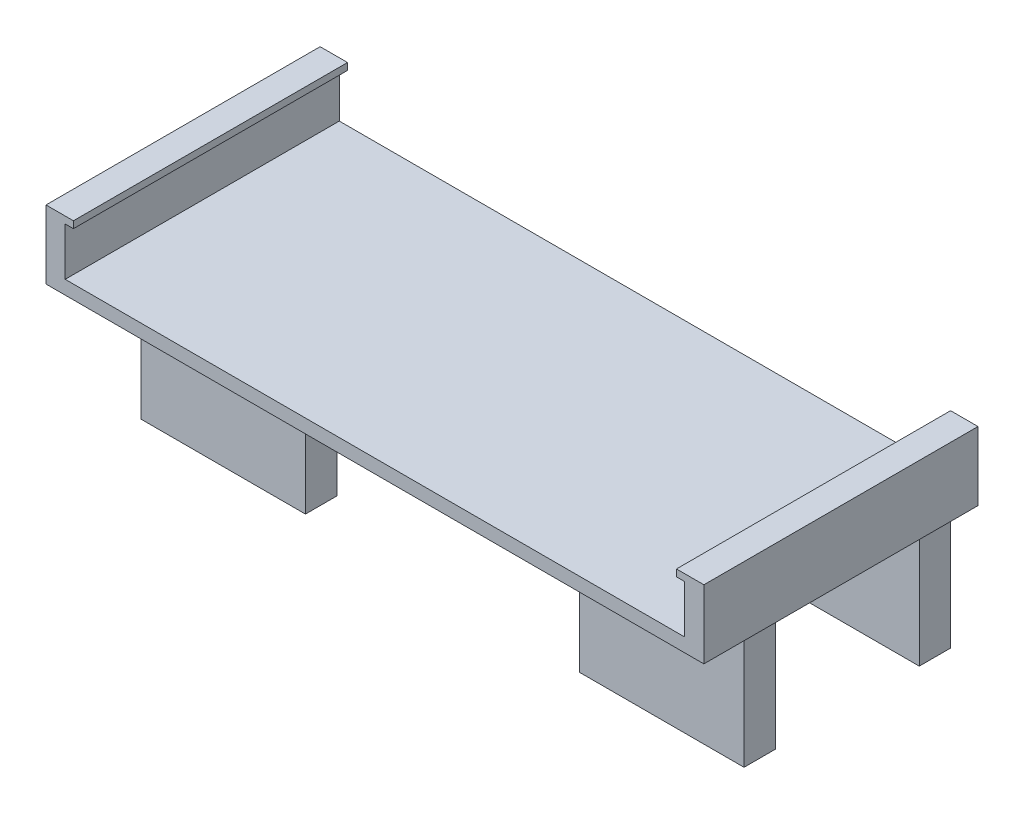
ISO-10303-21;
HEADER;
FILE_DESCRIPTION(('STEP AP214'),'2;1');
FILE_NAME('part.step','',(''),(''),'','','');
FILE_SCHEMA(('AUTOMOTIVE_DESIGN { 1 0 10303 214 1 1 1 1 }'));
ENDSEC;
DATA;
#1=APPLICATION_CONTEXT('core data for automotive mechanical design processes');
#2=APPLICATION_PROTOCOL_DEFINITION('international standard','automotive_design',2000,#1);
#3=PRODUCT_CONTEXT('',#1,'mechanical');
#4=PRODUCT('Part','Part','',(#3));
#5=PRODUCT_RELATED_PRODUCT_CATEGORY('part','',(#4));
#6=PRODUCT_DEFINITION_FORMATION('','',#4);
#7=PRODUCT_DEFINITION_CONTEXT('part definition',#1,'design');
#8=PRODUCT_DEFINITION('design','',#6,#7);
#9=PRODUCT_DEFINITION_SHAPE('','',#8);
#10=(LENGTH_UNIT() NAMED_UNIT(*) SI_UNIT(.MILLI.,.METRE.));
#11=(NAMED_UNIT(*) PLANE_ANGLE_UNIT() SI_UNIT($,.RADIAN.));
#12=(NAMED_UNIT(*) SI_UNIT($,.STERADIAN.) SOLID_ANGLE_UNIT());
#13=UNCERTAINTY_MEASURE_WITH_UNIT(LENGTH_MEASURE(1.E-05),#10,'distance_accuracy_value','');
#14=(GEOMETRIC_REPRESENTATION_CONTEXT(3) GLOBAL_UNCERTAINTY_ASSIGNED_CONTEXT((#13)) GLOBAL_UNIT_ASSIGNED_CONTEXT((#10,
#11,#12)) REPRESENTATION_CONTEXT('',''));
#15=CARTESIAN_POINT('',(0.,0.,0.));
#16=DIRECTION('',(0.,0.,1.));
#17=DIRECTION('',(1.,0.,0.));
#18=AXIS2_PLACEMENT_3D('',#15,#16,#17);
#19=CARTESIAN_POINT('',(0.,-10.,0.));
#20=DIRECTION('',(0.,-1.,0.));
#21=DIRECTION('',(0.,0.,-1.));
#22=AXIS2_PLACEMENT_3D('',#19,#20,#21);
#23=PLANE('',#22);
#24=DIRECTION('',(1.,0.,0.));
#25=VECTOR('',#24,1.);
#26=CARTESIAN_POINT('',(-24.78,-10.,-12.3407142857143));
#27=LINE('',#26,#25);
#28=CARTESIAN_POINT('',(-22.78,-10.,-12.3407142857143));
#29=VERTEX_POINT('',#28);
#30=CARTESIAN_POINT('',(-10.78,-10.,-12.3407142857143));
#31=VERTEX_POINT('',#30);
#32=EDGE_CURVE('E256',#29,#31,#27,.T.);
#33=ORIENTED_EDGE('',*,*,#32,.F.);
#34=DIRECTION('',(0.,0.,-1.));
#35=VECTOR('',#34,1.);
#36=CARTESIAN_POINT('',(-22.78,-10.,0.444285714285717));
#37=LINE('',#36,#35);
#38=CARTESIAN_POINT('',(-22.78,-10.,-14.6257142857143));
#39=VERTEX_POINT('',#38);
#40=EDGE_CURVE('E338',#29,#39,#37,.T.);
#41=ORIENTED_EDGE('',*,*,#40,.T.);
#42=DIRECTION('',(1.,0.,0.));
#43=VECTOR('',#42,1.);
#44=CARTESIAN_POINT('',(-22.78,-10.,-14.6257142857143));
#45=LINE('',#44,#43);
#46=CARTESIAN_POINT('',(-10.78,-10.,-14.6257142857143));
#47=VERTEX_POINT('',#46);
#48=EDGE_CURVE('E344',#39,#47,#45,.T.);
#49=ORIENTED_EDGE('',*,*,#48,.T.);
#50=DIRECTION('',(0.,0.,1.));
#51=VECTOR('',#50,1.);
#52=CARTESIAN_POINT('',(-10.78,-10.,-14.6257142857143));
#53=LINE('',#52,#51);
#54=EDGE_CURVE('E348',#47,#31,#53,.T.);
#55=ORIENTED_EDGE('',*,*,#54,.T.);
#56=EDGE_LOOP('',(#33,#41,#49,#55));
#57=FACE_BOUND('',#56,.T.);
#58=ADVANCED_FACE('F39',(#57),#23,.T.);
#59=CARTESIAN_POINT('',(0.,-10.,0.));
#60=DIRECTION('',(0.,-1.,0.));
#61=DIRECTION('',(0.,0.,-1.));
#62=AXIS2_PLACEMENT_3D('',#59,#60,#61);
#63=PLANE('',#62);
#64=DIRECTION('',(1.,0.,0.));
#65=VECTOR('',#64,1.);
#66=CARTESIAN_POINT('',(0.,-10.,-12.3407142857143));
#67=LINE('',#66,#65);
#68=CARTESIAN_POINT('',(9.21999999999999,-10.,-12.3407142857143));
#69=VERTEX_POINT('',#68);
#70=CARTESIAN_POINT('',(21.22,-10.,-12.3407142857143));
#71=VERTEX_POINT('',#70);
#72=EDGE_CURVE('E11',#69,#71,#67,.T.);
#73=ORIENTED_EDGE('',*,*,#72,.F.);
#74=DIRECTION('',(0.,0.,-1.));
#75=VECTOR('',#74,1.);
#76=CARTESIAN_POINT('',(9.22,-10.,0.444285714285717));
#77=LINE('',#76,#75);
#78=CARTESIAN_POINT('',(9.21999999999999,-10.,-14.6257142857143));
#79=VERTEX_POINT('',#78);
#80=EDGE_CURVE('E298',#69,#79,#77,.T.);
#81=ORIENTED_EDGE('',*,*,#80,.T.);
#82=DIRECTION('',(1.,0.,0.));
#83=VECTOR('',#82,1.);
#84=CARTESIAN_POINT('',(9.21999999999999,-10.,-14.6257142857143));
#85=LINE('',#84,#83);
#86=CARTESIAN_POINT('',(21.22,-10.,-14.6257142857143));
#87=VERTEX_POINT('',#86);
#88=EDGE_CURVE('E304',#79,#87,#85,.T.);
#89=ORIENTED_EDGE('',*,*,#88,.T.);
#90=DIRECTION('',(0.,0.,1.));
#91=VECTOR('',#90,1.);
#92=CARTESIAN_POINT('',(21.22,-10.,-14.6257142857143));
#93=LINE('',#92,#91);
#94=EDGE_CURVE('E307',#87,#71,#93,.T.);
#95=ORIENTED_EDGE('',*,*,#94,.T.);
#96=EDGE_LOOP('',(#73,#81,#89,#95));
#97=FACE_BOUND('',#96,.T.);
#98=ADVANCED_FACE('F595',(#97),#63,.T.);
#99=CARTESIAN_POINT('',(0.,0.,0.));
#100=DIRECTION('',(0.,1.,0.));
#101=DIRECTION('',(0.,0.,1.));
#102=AXIS2_PLACEMENT_3D('',#99,#100,#101);
#103=PLANE('',#102);
#104=DIRECTION('',(0.,0.,-1.));
#105=VECTOR('',#104,1.);
#106=CARTESIAN_POINT('',(9.22,0.,0.444285714285717));
#107=LINE('',#106,#105);
#108=CARTESIAN_POINT('',(9.22,0.,0.444285714285717));
#109=VERTEX_POINT('',#108);
#110=CARTESIAN_POINT('',(9.22,0.,-14.6257142857143));
#111=VERTEX_POINT('',#110);
#112=EDGE_CURVE('E315',#109,#111,#107,.T.);
#113=ORIENTED_EDGE('',*,*,#112,.F.);
#114=DIRECTION('',(-1.,0.,0.));
#115=VECTOR('',#114,1.);
#116=CARTESIAN_POINT('',(21.22,0.,0.444285714285718));
#117=LINE('',#116,#115);
#118=CARTESIAN_POINT('',(21.22,0.,0.444285714285718));
#119=VERTEX_POINT('',#118);
#120=EDGE_CURVE('E293',#119,#109,#117,.T.);
#121=ORIENTED_EDGE('',*,*,#120,.F.);
#122=DIRECTION('',(0.,0.,1.));
#123=VECTOR('',#122,1.);
#124=CARTESIAN_POINT('',(21.22,0.,-14.6257142857143));
#125=LINE('',#124,#123);
#126=CARTESIAN_POINT('',(21.22,0.,-14.6257142857143));
#127=VERTEX_POINT('',#126);
#128=EDGE_CURVE('E299',#127,#119,#125,.T.);
#129=ORIENTED_EDGE('',*,*,#128,.F.);
#130=DIRECTION('',(-1.,0.,0.));
#131=VECTOR('',#130,1.);
#132=CARTESIAN_POINT('',(-24.78,0.,-14.6257142857143));
#133=LINE('',#132,#131);
#134=CARTESIAN_POINT('',(23.22,0.,-14.6257142857143));
#135=VERTEX_POINT('',#134);
#136=EDGE_CURVE('E464',#135,#127,#133,.T.);
#137=ORIENTED_EDGE('',*,*,#136,.F.);
#138=DIRECTION('',(0.,0.,-1.));
#139=VECTOR('',#138,1.);
#140=CARTESIAN_POINT('',(23.22,0.,-14.6257142857143));
#141=LINE('',#140,#139);
#142=CARTESIAN_POINT('',(23.22,0.,5.37428571428572));
#143=VERTEX_POINT('',#142);
#144=EDGE_CURVE('E484',#143,#135,#141,.T.);
#145=ORIENTED_EDGE('',*,*,#144,.F.);
#146=DIRECTION('',(1.,0.,0.));
#147=VECTOR('',#146,1.);
#148=CARTESIAN_POINT('',(-24.78,0.,5.37428571428572));
#149=LINE('',#148,#147);
#150=CARTESIAN_POINT('',(-24.78,0.,5.37428571428572));
#151=VERTEX_POINT('',#150);
#152=EDGE_CURVE('E481',#151,#143,#149,.T.);
#153=ORIENTED_EDGE('',*,*,#152,.F.);
#154=DIRECTION('',(0.,0.,1.));
#155=VECTOR('',#154,1.);
#156=CARTESIAN_POINT('',(-24.78,0.,-14.6257142857143));
#157=LINE('',#156,#155);
#158=CARTESIAN_POINT('',(-24.78,0.,-14.6257142857143));
#159=VERTEX_POINT('',#158);
#160=EDGE_CURVE('E438',#159,#151,#157,.T.);
#161=ORIENTED_EDGE('',*,*,#160,.F.);
#162=CARTESIAN_POINT('',(-22.78,0.,-14.6257142857143));
#163=VERTEX_POINT('',#162);
#164=EDGE_CURVE('E487',#163,#159,#133,.T.);
#165=ORIENTED_EDGE('',*,*,#164,.F.);
#166=DIRECTION('',(0.,0.,-1.));
#167=VECTOR('',#166,1.);
#168=CARTESIAN_POINT('',(-22.78,0.,0.444285714285717));
#169=LINE('',#168,#167);
#170=CARTESIAN_POINT('',(-22.78,0.,0.444285714285717));
#171=VERTEX_POINT('',#170);
#172=EDGE_CURVE('E356',#171,#163,#169,.T.);
#173=ORIENTED_EDGE('',*,*,#172,.F.);
#174=DIRECTION('',(-1.,0.,0.));
#175=VECTOR('',#174,1.);
#176=CARTESIAN_POINT('',(-10.78,0.,0.444285714285718));
#177=LINE('',#176,#175);
#178=CARTESIAN_POINT('',(-10.78,0.,0.444285714285718));
#179=VERTEX_POINT('',#178);
#180=EDGE_CURVE('E333',#179,#171,#177,.T.);
#181=ORIENTED_EDGE('',*,*,#180,.F.);
#182=DIRECTION('',(0.,0.,1.));
#183=VECTOR('',#182,1.);
#184=CARTESIAN_POINT('',(-10.78,0.,-14.6257142857143));
#185=LINE('',#184,#183);
#186=CARTESIAN_POINT('',(-10.78,0.,-14.6257142857143));
#187=VERTEX_POINT('',#186);
#188=EDGE_CURVE('E339',#187,#179,#185,.T.);
#189=ORIENTED_EDGE('',*,*,#188,.F.);
#190=EDGE_CURVE('E491',#111,#187,#133,.T.);
#191=ORIENTED_EDGE('',*,*,#190,.F.);
#192=EDGE_LOOP('',(#113,#121,#129,#137,#145,#153,#161,#165,#173,#181,#189,#191));
#193=FACE_BOUND('',#192,.T.);
#194=ADVANCED_FACE('F523',(#193),#103,.F.);
#195=CARTESIAN_POINT('',(0.,5.,0.));
#196=DIRECTION('',(0.,1.,0.));
#197=DIRECTION('',(0.,0.,1.));
#198=AXIS2_PLACEMENT_3D('',#195,#196,#197);
#199=PLANE('',#198);
#200=DIRECTION('',(0.,0.,1.));
#201=VECTOR('',#200,1.);
#202=CARTESIAN_POINT('',(21.22,5.,-14.6257142857143));
#203=LINE('',#202,#201);
#204=CARTESIAN_POINT('',(21.22,5.,-14.6257142857143));
#205=VERTEX_POINT('',#204);
#206=CARTESIAN_POINT('',(21.22,5.,5.37428571428572));
#207=VERTEX_POINT('',#206);
#208=EDGE_CURVE('E434',#205,#207,#203,.T.);
#209=ORIENTED_EDGE('',*,*,#208,.T.);
#210=DIRECTION('',(1.,0.,0.));
#211=VECTOR('',#210,1.);
#212=CARTESIAN_POINT('',(-24.78,5.,5.37428571428572));
#213=LINE('',#212,#211);
#214=CARTESIAN_POINT('',(23.22,5.,5.37428571428572));
#215=VERTEX_POINT('',#214);
#216=EDGE_CURVE('E463',#207,#215,#213,.T.);
#217=ORIENTED_EDGE('',*,*,#216,.T.);
#218=DIRECTION('',(0.,0.,-1.));
#219=VECTOR('',#218,1.);
#220=CARTESIAN_POINT('',(23.22,5.,-14.6257142857143));
#221=LINE('',#220,#219);
#222=CARTESIAN_POINT('',(23.22,5.,-14.6257142857143));
#223=VERTEX_POINT('',#222);
#224=EDGE_CURVE('E469',#215,#223,#221,.T.);
#225=ORIENTED_EDGE('',*,*,#224,.T.);
#226=DIRECTION('',(-1.,0.,0.));
#227=VECTOR('',#226,1.);
#228=CARTESIAN_POINT('',(-24.78,5.,-14.6257142857143));
#229=LINE('',#228,#227);
#230=EDGE_CURVE('E473',#223,#205,#229,.T.);
#231=ORIENTED_EDGE('',*,*,#230,.T.);
#232=EDGE_LOOP('',(#209,#217,#225,#231));
#233=FACE_BOUND('',#232,.T.);
#234=ADVANCED_FACE('F551',(#233),#199,.T.);
#235=CARTESIAN_POINT('',(-24.78,5.,-14.6257142857143));
#236=DIRECTION('',(1.,0.,0.));
#237=DIRECTION('',(0.,0.,-1.));
#238=AXIS2_PLACEMENT_3D('',#235,#236,#237);
#239=PLANE('',#238);
#240=ORIENTED_EDGE('',*,*,#160,.T.);
#241=DIRECTION('',(0.,-1.,0.));
#242=VECTOR('',#241,1.);
#243=CARTESIAN_POINT('',(-24.78,5.,5.37428571428572));
#244=LINE('',#243,#242);
#245=CARTESIAN_POINT('',(-24.78,5.,5.37428571428572));
#246=VERTEX_POINT('',#245);
#247=EDGE_CURVE('E503',#246,#151,#244,.T.);
#248=ORIENTED_EDGE('',*,*,#247,.F.);
#249=DIRECTION('',(0.,0.,1.));
#250=VECTOR('',#249,1.);
#251=CARTESIAN_POINT('',(-24.78,5.,-14.6257142857143));
#252=LINE('',#251,#250);
#253=CARTESIAN_POINT('',(-24.78,5.,-14.6257142857143));
#254=VERTEX_POINT('',#253);
#255=EDGE_CURVE('E459',#254,#246,#252,.T.);
#256=ORIENTED_EDGE('',*,*,#255,.F.);
#257=DIRECTION('',(0.,-1.,0.));
#258=VECTOR('',#257,1.);
#259=CARTESIAN_POINT('',(-24.78,5.,-14.6257142857143));
#260=LINE('',#259,#258);
#261=EDGE_CURVE('E477',#254,#159,#260,.T.);
#262=ORIENTED_EDGE('',*,*,#261,.T.);
#263=EDGE_LOOP('',(#240,#248,#256,#262));
#264=FACE_BOUND('',#263,.T.);
#265=ADVANCED_FACE('F41',(#264),#239,.F.);
#266=CARTESIAN_POINT('',(-24.78,5.,5.37428571428572));
#267=DIRECTION('',(0.,0.,-1.));
#268=DIRECTION('',(-1.,0.,0.));
#269=AXIS2_PLACEMENT_3D('',#266,#267,#268);
#270=PLANE('',#269);
#271=ORIENTED_EDGE('',*,*,#216,.F.);
#272=DIRECTION('',(0.,1.,0.));
#273=VECTOR('',#272,1.);
#274=CARTESIAN_POINT('',(21.22,4.50000000000001,5.37428571428572));
#275=LINE('',#274,#273);
#276=CARTESIAN_POINT('',(21.22,4.50000000000001,5.37428571428572));
#277=VERTEX_POINT('',#276);
#278=EDGE_CURVE('E384',#277,#207,#275,.T.);
#279=ORIENTED_EDGE('',*,*,#278,.F.);
#280=DIRECTION('',(-1.,0.,0.));
#281=VECTOR('',#280,1.);
#282=CARTESIAN_POINT('',(21.82,4.50000000000001,5.37428571428572));
#283=LINE('',#282,#281);
#284=CARTESIAN_POINT('',(21.82,4.50000000000001,5.37428571428572));
#285=VERTEX_POINT('',#284);
#286=EDGE_CURVE('E428',#285,#277,#283,.T.);
#287=ORIENTED_EDGE('',*,*,#286,.F.);
#288=DIRECTION('',(0.,1.,0.));
#289=VECTOR('',#288,1.);
#290=CARTESIAN_POINT('',(21.82,1.,5.37428571428572));
#291=LINE('',#290,#289);
#292=CARTESIAN_POINT('',(21.82,1.,5.37428571428572));
#293=VERTEX_POINT('',#292);
#294=EDGE_CURVE('E424',#293,#285,#291,.T.);
#295=ORIENTED_EDGE('',*,*,#294,.F.);
#296=DIRECTION('',(1.,0.,0.));
#297=VECTOR('',#296,1.);
#298=CARTESIAN_POINT('',(-23.38,1.,5.37428571428572));
#299=LINE('',#298,#297);
#300=CARTESIAN_POINT('',(-23.38,1.,5.37428571428572));
#301=VERTEX_POINT('',#300);
#302=EDGE_CURVE('E420',#301,#293,#299,.T.);
#303=ORIENTED_EDGE('',*,*,#302,.F.);
#304=DIRECTION('',(0.,-1.,0.));
#305=VECTOR('',#304,1.);
#306=CARTESIAN_POINT('',(-23.38,4.5,5.37428571428572));
#307=LINE('',#306,#305);
#308=CARTESIAN_POINT('',(-23.38,4.5,5.37428571428572));
#309=VERTEX_POINT('',#308);
#310=EDGE_CURVE('E416',#309,#301,#307,.T.);
#311=ORIENTED_EDGE('',*,*,#310,.F.);
#312=DIRECTION('',(-1.,0.,0.));
#313=VECTOR('',#312,1.);
#314=CARTESIAN_POINT('',(-22.78,4.5,5.37428571428572));
#315=LINE('',#314,#313);
#316=CARTESIAN_POINT('',(-22.78,4.5,5.37428571428572));
#317=VERTEX_POINT('',#316);
#318=EDGE_CURVE('E412',#317,#309,#315,.T.);
#319=ORIENTED_EDGE('',*,*,#318,.F.);
#320=DIRECTION('',(0.,-1.,0.));
#321=VECTOR('',#320,1.);
#322=CARTESIAN_POINT('',(-22.78,5.,5.37428571428572));
#323=LINE('',#322,#321);
#324=CARTESIAN_POINT('',(-22.78,5.,5.37428571428572));
#325=VERTEX_POINT('',#324);
#326=EDGE_CURVE('E378',#325,#317,#323,.T.);
#327=ORIENTED_EDGE('',*,*,#326,.F.);
#328=EDGE_CURVE('E465',#246,#325,#213,.T.);
#329=ORIENTED_EDGE('',*,*,#328,.F.);
#330=ORIENTED_EDGE('',*,*,#247,.T.);
#331=ORIENTED_EDGE('',*,*,#152,.T.);
#332=DIRECTION('',(0.,-1.,0.));
#333=VECTOR('',#332,1.);
#334=CARTESIAN_POINT('',(23.22,5.,5.37428571428572));
#335=LINE('',#334,#333);
#336=EDGE_CURVE('E499',#215,#143,#335,.T.);
#337=ORIENTED_EDGE('',*,*,#336,.F.);
#338=EDGE_LOOP('',(#271,#279,#287,#295,#303,#311,#319,#327,#329,#330,#331,#337));
#339=FACE_BOUND('',#338,.T.);
#340=ADVANCED_FACE('F542',(#339),#270,.F.);
#341=CARTESIAN_POINT('',(23.22,5.,-14.6257142857143));
#342=DIRECTION('',(-1.,0.,0.));
#343=DIRECTION('',(0.,0.,1.));
#344=AXIS2_PLACEMENT_3D('',#341,#342,#343);
#345=PLANE('',#344);
#346=ORIENTED_EDGE('',*,*,#144,.T.);
#347=DIRECTION('',(0.,-1.,0.));
#348=VECTOR('',#347,1.);
#349=CARTESIAN_POINT('',(23.22,5.,-14.6257142857143));
#350=LINE('',#349,#348);
#351=EDGE_CURVE('E495',#223,#135,#350,.T.);
#352=ORIENTED_EDGE('',*,*,#351,.F.);
#353=ORIENTED_EDGE('',*,*,#224,.F.);
#354=ORIENTED_EDGE('',*,*,#336,.T.);
#355=EDGE_LOOP('',(#346,#352,#353,#354));
#356=FACE_BOUND('',#355,.T.);
#357=ADVANCED_FACE('F556',(#356),#345,.F.);
#358=CARTESIAN_POINT('',(-24.78,5.,-14.6257142857143));
#359=DIRECTION('',(0.,0.,1.));
#360=DIRECTION('',(1.,0.,0.));
#361=AXIS2_PLACEMENT_3D('',#358,#359,#360);
#362=PLANE('',#361);
#363=DIRECTION('',(-1.,0.,0.));
#364=VECTOR('',#363,1.);
#365=CARTESIAN_POINT('',(21.82,4.50000000000001,-14.6257142857143));
#366=LINE('',#365,#364);
#367=CARTESIAN_POINT('',(21.82,4.50000000000001,-14.6257142857143));
#368=VERTEX_POINT('',#367);
#369=CARTESIAN_POINT('',(21.22,4.50000000000001,-14.6257142857143));
#370=VERTEX_POINT('',#369);
#371=EDGE_CURVE('E400',#368,#370,#366,.T.);
#372=ORIENTED_EDGE('',*,*,#371,.T.);
#373=DIRECTION('',(0.,1.,0.));
#374=VECTOR('',#373,1.);
#375=CARTESIAN_POINT('',(21.22,4.50000000000001,-14.6257142857143));
#376=LINE('',#375,#374);
#377=EDGE_CURVE('E404',#370,#205,#376,.T.);
#378=ORIENTED_EDGE('',*,*,#377,.T.);
#379=ORIENTED_EDGE('',*,*,#230,.F.);
#380=ORIENTED_EDGE('',*,*,#351,.T.);
#381=ORIENTED_EDGE('',*,*,#136,.T.);
#382=DIRECTION('',(0.,1.,0.));
#383=VECTOR('',#382,1.);
#384=CARTESIAN_POINT('',(21.22,-10.,-14.6257142857143));
#385=LINE('',#384,#383);
#386=EDGE_CURVE('E324',#87,#127,#385,.T.);
#387=ORIENTED_EDGE('',*,*,#386,.F.);
#388=ORIENTED_EDGE('',*,*,#88,.F.);
#389=DIRECTION('',(0.,1.,0.));
#390=VECTOR('',#389,1.);
#391=CARTESIAN_POINT('',(9.21999999999999,-10.,-14.6257142857143));
#392=LINE('',#391,#390);
#393=EDGE_CURVE('E327',#79,#111,#392,.T.);
#394=ORIENTED_EDGE('',*,*,#393,.T.);
#395=ORIENTED_EDGE('',*,*,#190,.T.);
#396=DIRECTION('',(0.,1.,0.));
#397=VECTOR('',#396,1.);
#398=CARTESIAN_POINT('',(-10.78,-10.,-14.6257142857143));
#399=LINE('',#398,#397);
#400=EDGE_CURVE('E366',#47,#187,#399,.T.);
#401=ORIENTED_EDGE('',*,*,#400,.F.);
#402=ORIENTED_EDGE('',*,*,#48,.F.);
#403=DIRECTION('',(0.,1.,0.));
#404=VECTOR('',#403,1.);
#405=CARTESIAN_POINT('',(-22.78,-10.,-14.6257142857143));
#406=LINE('',#405,#404);
#407=EDGE_CURVE('E370',#39,#163,#406,.T.);
#408=ORIENTED_EDGE('',*,*,#407,.T.);
#409=ORIENTED_EDGE('',*,*,#164,.T.);
#410=ORIENTED_EDGE('',*,*,#261,.F.);
#411=CARTESIAN_POINT('',(-22.78,5.,-14.6257142857143));
#412=VERTEX_POINT('',#411);
#413=EDGE_CURVE('E472',#412,#254,#229,.T.);
#414=ORIENTED_EDGE('',*,*,#413,.F.);
#415=DIRECTION('',(0.,-1.,0.));
#416=VECTOR('',#415,1.);
#417=CARTESIAN_POINT('',(-22.78,5.,-14.6257142857143));
#418=LINE('',#417,#416);
#419=CARTESIAN_POINT('',(-22.78,4.5,-14.6257142857143));
#420=VERTEX_POINT('',#419);
#421=EDGE_CURVE('E379',#412,#420,#418,.T.);
#422=ORIENTED_EDGE('',*,*,#421,.T.);
#423=DIRECTION('',(-1.,0.,0.));
#424=VECTOR('',#423,1.);
#425=CARTESIAN_POINT('',(-22.78,4.5,-14.6257142857143));
#426=LINE('',#425,#424);
#427=CARTESIAN_POINT('',(-23.38,4.5,-14.6257142857143));
#428=VERTEX_POINT('',#427);
#429=EDGE_CURVE('E383',#420,#428,#426,.T.);
#430=ORIENTED_EDGE('',*,*,#429,.T.);
#431=DIRECTION('',(0.,-1.,0.));
#432=VECTOR('',#431,1.);
#433=CARTESIAN_POINT('',(-23.38,4.5,-14.6257142857143));
#434=LINE('',#433,#432);
#435=CARTESIAN_POINT('',(-23.38,1.,-14.6257142857143));
#436=VERTEX_POINT('',#435);
#437=EDGE_CURVE('E388',#428,#436,#434,.T.);
#438=ORIENTED_EDGE('',*,*,#437,.T.);
#439=DIRECTION('',(1.,0.,0.));
#440=VECTOR('',#439,1.);
#441=CARTESIAN_POINT('',(-23.38,1.,-14.6257142857143));
#442=LINE('',#441,#440);
#443=CARTESIAN_POINT('',(21.82,1.,-14.6257142857143));
#444=VERTEX_POINT('',#443);
#445=EDGE_CURVE('E392',#436,#444,#442,.T.);
#446=ORIENTED_EDGE('',*,*,#445,.T.);
#447=DIRECTION('',(0.,1.,0.));
#448=VECTOR('',#447,1.);
#449=CARTESIAN_POINT('',(21.82,1.,-14.6257142857143));
#450=LINE('',#449,#448);
#451=EDGE_CURVE('E396',#444,#368,#450,.T.);
#452=ORIENTED_EDGE('',*,*,#451,.T.);
#453=EDGE_LOOP('',(#372,#378,#379,#380,#381,#387,#388,#394,#395,#401,#402,#408,#409,#410,#414,
#422,#430,#438,#446,#452));
#454=FACE_BOUND('',#453,.T.);
#455=ADVANCED_FACE('F529',(#454),#362,.F.);
#456=DIRECTION('',(0.,0.,1.));
#457=VECTOR('',#456,1.);
#458=CARTESIAN_POINT('',(-22.78,5.,-14.6257142857143));
#459=LINE('',#458,#457);
#460=EDGE_CURVE('E408',#412,#325,#459,.T.);
#461=ORIENTED_EDGE('',*,*,#460,.F.);
#462=ORIENTED_EDGE('',*,*,#413,.T.);
#463=ORIENTED_EDGE('',*,*,#255,.T.);
#464=ORIENTED_EDGE('',*,*,#328,.T.);
#465=EDGE_LOOP('',(#461,#462,#463,#464));
#466=FACE_BOUND('',#465,.T.);
#467=ADVANCED_FACE('F547',(#466),#199,.T.);
#468=CARTESIAN_POINT('',(21.22,4.50000000000001,-14.6257142857143));
#469=DIRECTION('',(1.,0.,0.));
#470=DIRECTION('',(0.,0.,-1.));
#471=AXIS2_PLACEMENT_3D('',#468,#469,#470);
#472=PLANE('',#471);
#473=ORIENTED_EDGE('',*,*,#278,.T.);
#474=ORIENTED_EDGE('',*,*,#208,.F.);
#475=ORIENTED_EDGE('',*,*,#377,.F.);
#476=DIRECTION('',(0.,0.,1.));
#477=VECTOR('',#476,1.);
#478=CARTESIAN_POINT('',(21.22,4.50000000000001,-14.6257142857143));
#479=LINE('',#478,#477);
#480=EDGE_CURVE('E439',#370,#277,#479,.T.);
#481=ORIENTED_EDGE('',*,*,#480,.T.);
#482=EDGE_LOOP('',(#473,#474,#475,#481));
#483=FACE_BOUND('',#482,.T.);
#484=ADVANCED_FACE('F561',(#483),#472,.F.);
#485=CARTESIAN_POINT('',(21.82,4.50000000000001,-14.6257142857143));
#486=DIRECTION('',(0.,1.,0.));
#487=DIRECTION('',(0.,0.,1.));
#488=AXIS2_PLACEMENT_3D('',#485,#486,#487);
#489=PLANE('',#488);
#490=ORIENTED_EDGE('',*,*,#286,.T.);
#491=ORIENTED_EDGE('',*,*,#480,.F.);
#492=ORIENTED_EDGE('',*,*,#371,.F.);
#493=DIRECTION('',(0.,0.,1.));
#494=VECTOR('',#493,1.);
#495=CARTESIAN_POINT('',(21.82,4.50000000000001,-14.6257142857143));
#496=LINE('',#495,#494);
#497=EDGE_CURVE('E442',#368,#285,#496,.T.);
#498=ORIENTED_EDGE('',*,*,#497,.T.);
#499=EDGE_LOOP('',(#490,#491,#492,#498));
#500=FACE_BOUND('',#499,.T.);
#501=ADVANCED_FACE('F566',(#500),#489,.F.);
#502=CARTESIAN_POINT('',(21.82,1.,-14.6257142857143));
#503=DIRECTION('',(1.,0.,0.));
#504=DIRECTION('',(0.,0.,-1.));
#505=AXIS2_PLACEMENT_3D('',#502,#503,#504);
#506=PLANE('',#505);
#507=ORIENTED_EDGE('',*,*,#294,.T.);
#508=ORIENTED_EDGE('',*,*,#497,.F.);
#509=ORIENTED_EDGE('',*,*,#451,.F.);
#510=DIRECTION('',(0.,0.,1.));
#511=VECTOR('',#510,1.);
#512=CARTESIAN_POINT('',(21.82,1.,-14.6257142857143));
#513=LINE('',#512,#511);
#514=EDGE_CURVE('E445',#444,#293,#513,.T.);
#515=ORIENTED_EDGE('',*,*,#514,.T.);
#516=EDGE_LOOP('',(#507,#508,#509,#515));
#517=FACE_BOUND('',#516,.T.);
#518=ADVANCED_FACE('F569',(#517),#506,.F.);
#519=CARTESIAN_POINT('',(-23.38,1.,-14.6257142857143));
#520=DIRECTION('',(0.,-1.,0.));
#521=DIRECTION('',(0.,0.,-1.));
#522=AXIS2_PLACEMENT_3D('',#519,#520,#521);
#523=PLANE('',#522);
#524=ORIENTED_EDGE('',*,*,#302,.T.);
#525=ORIENTED_EDGE('',*,*,#514,.F.);
#526=ORIENTED_EDGE('',*,*,#445,.F.);
#527=DIRECTION('',(0.,0.,1.));
#528=VECTOR('',#527,1.);
#529=CARTESIAN_POINT('',(-23.38,1.,-14.6257142857143));
#530=LINE('',#529,#528);
#531=EDGE_CURVE('E448',#436,#301,#530,.T.);
#532=ORIENTED_EDGE('',*,*,#531,.T.);
#533=EDGE_LOOP('',(#524,#525,#526,#532));
#534=FACE_BOUND('',#533,.T.);
#535=ADVANCED_FACE('F572',(#534),#523,.F.);
#536=CARTESIAN_POINT('',(-23.38,4.5,-14.6257142857143));
#537=DIRECTION('',(-1.,0.,0.));
#538=DIRECTION('',(0.,0.,1.));
#539=AXIS2_PLACEMENT_3D('',#536,#537,#538);
#540=PLANE('',#539);
#541=ORIENTED_EDGE('',*,*,#310,.T.);
#542=ORIENTED_EDGE('',*,*,#531,.F.);
#543=ORIENTED_EDGE('',*,*,#437,.F.);
#544=DIRECTION('',(0.,0.,1.));
#545=VECTOR('',#544,1.);
#546=CARTESIAN_POINT('',(-23.38,4.5,-14.6257142857143));
#547=LINE('',#546,#545);
#548=EDGE_CURVE('E451',#428,#309,#547,.T.);
#549=ORIENTED_EDGE('',*,*,#548,.T.);
#550=EDGE_LOOP('',(#541,#542,#543,#549));
#551=FACE_BOUND('',#550,.T.);
#552=ADVANCED_FACE('F575',(#551),#540,.F.);
#553=CARTESIAN_POINT('',(-22.78,4.5,-14.6257142857143));
#554=DIRECTION('',(0.,1.,0.));
#555=DIRECTION('',(-1.,0.,0.));
#556=AXIS2_PLACEMENT_3D('',#553,#554,#555);
#557=PLANE('',#556);
#558=ORIENTED_EDGE('',*,*,#318,.T.);
#559=ORIENTED_EDGE('',*,*,#548,.F.);
#560=ORIENTED_EDGE('',*,*,#429,.F.);
#561=DIRECTION('',(0.,0.,1.));
#562=VECTOR('',#561,1.);
#563=CARTESIAN_POINT('',(-22.78,4.5,-14.6257142857143));
#564=LINE('',#563,#562);
#565=EDGE_CURVE('E454',#420,#317,#564,.T.);
#566=ORIENTED_EDGE('',*,*,#565,.T.);
#567=EDGE_LOOP('',(#558,#559,#560,#566));
#568=FACE_BOUND('',#567,.T.);
#569=ADVANCED_FACE('F579',(#568),#557,.F.);
#570=CARTESIAN_POINT('',(-22.78,5.,-14.6257142857143));
#571=DIRECTION('',(-1.,0.,0.));
#572=DIRECTION('',(0.,0.,1.));
#573=AXIS2_PLACEMENT_3D('',#570,#571,#572);
#574=PLANE('',#573);
#575=ORIENTED_EDGE('',*,*,#326,.T.);
#576=ORIENTED_EDGE('',*,*,#565,.F.);
#577=ORIENTED_EDGE('',*,*,#421,.F.);
#578=ORIENTED_EDGE('',*,*,#460,.T.);
#579=EDGE_LOOP('',(#575,#576,#577,#578));
#580=FACE_BOUND('',#579,.T.);
#581=ADVANCED_FACE('F581',(#580),#574,.F.);
#582=CARTESIAN_POINT('',(-10.78,-10.,0.444285714285718));
#583=DIRECTION('',(0.,0.,-1.));
#584=DIRECTION('',(-1.,0.,0.));
#585=AXIS2_PLACEMENT_3D('',#582,#583,#584);
#586=PLANE('',#585);
#587=ORIENTED_EDGE('',*,*,#180,.T.);
#588=DIRECTION('',(0.,1.,0.));
#589=VECTOR('',#588,1.);
#590=CARTESIAN_POINT('',(-22.78,-10.,0.444285714285717));
#591=LINE('',#590,#589);
#592=CARTESIAN_POINT('',(-22.78,-10.,0.444285714285717));
#593=VERTEX_POINT('',#592);
#594=EDGE_CURVE('E374',#593,#171,#591,.T.);
#595=ORIENTED_EDGE('',*,*,#594,.F.);
#596=DIRECTION('',(-1.,0.,0.));
#597=VECTOR('',#596,1.);
#598=CARTESIAN_POINT('',(-10.78,-10.,0.444285714285718));
#599=LINE('',#598,#597);
#600=CARTESIAN_POINT('',(-10.78,-10.,0.444285714285718));
#601=VERTEX_POINT('',#600);
#602=EDGE_CURVE('E334',#601,#593,#599,.T.);
#603=ORIENTED_EDGE('',*,*,#602,.F.);
#604=DIRECTION('',(0.,1.,0.));
#605=VECTOR('',#604,1.);
#606=CARTESIAN_POINT('',(-10.78,-10.,0.444285714285718));
#607=LINE('',#606,#605);
#608=EDGE_CURVE('E352',#601,#179,#607,.T.);
#609=ORIENTED_EDGE('',*,*,#608,.T.);
#610=EDGE_LOOP('',(#587,#595,#603,#609));
#611=FACE_BOUND('',#610,.T.);
#612=ADVANCED_FACE('F583',(#611),#586,.F.);
#613=CARTESIAN_POINT('',(-22.78,-10.,0.444285714285717));
#614=DIRECTION('',(1.,0.,0.));
#615=DIRECTION('',(0.,0.,-1.));
#616=AXIS2_PLACEMENT_3D('',#613,#614,#615);
#617=PLANE('',#616);
#618=ORIENTED_EDGE('',*,*,#40,.F.);
#619=DIRECTION('',(0.,1.,0.));
#620=VECTOR('',#619,1.);
#621=CARTESIAN_POINT('',(-22.78,-10.,-12.3407142857143));
#622=LINE('',#621,#620);
#623=CARTESIAN_POINT('',(-22.78,-2.,-12.3407142857143));
#624=VERTEX_POINT('',#623);
#625=EDGE_CURVE('E278',#29,#624,#622,.T.);
#626=ORIENTED_EDGE('',*,*,#625,.T.);
#627=DIRECTION('',(0.,0.,1.));
#628=VECTOR('',#627,1.);
#629=CARTESIAN_POINT('',(-22.78,-2.,0.444285714285718));
#630=LINE('',#629,#628);
#631=CARTESIAN_POINT('',(-22.78,-2.,-1.84071428571428));
#632=VERTEX_POINT('',#631);
#633=EDGE_CURVE('E289',#624,#632,#630,.T.);
#634=ORIENTED_EDGE('',*,*,#633,.T.);
#635=DIRECTION('',(0.,-1.,0.));
#636=VECTOR('',#635,1.);
#637=CARTESIAN_POINT('',(-22.78,-10.,-1.84071428571428));
#638=LINE('',#637,#636);
#639=CARTESIAN_POINT('',(-22.78,-10.,-1.84071428571428));
#640=VERTEX_POINT('',#639);
#641=EDGE_CURVE('E266',#632,#640,#638,.T.);
#642=ORIENTED_EDGE('',*,*,#641,.T.);
#643=EDGE_CURVE('E340',#593,#640,#37,.T.);
#644=ORIENTED_EDGE('',*,*,#643,.F.);
#645=ORIENTED_EDGE('',*,*,#594,.T.);
#646=ORIENTED_EDGE('',*,*,#172,.T.);
#647=ORIENTED_EDGE('',*,*,#407,.F.);
#648=EDGE_LOOP('',(#618,#626,#634,#642,#644,#645,#646,#647));
#649=FACE_BOUND('',#648,.T.);
#650=ADVANCED_FACE('F589',(#649),#617,.F.);
#651=CARTESIAN_POINT('',(-10.78,-10.,-14.6257142857143));
#652=DIRECTION('',(-1.,0.,0.));
#653=DIRECTION('',(0.,0.,1.));
#654=AXIS2_PLACEMENT_3D('',#651,#652,#653);
#655=PLANE('',#654);
#656=DIRECTION('',(0.,0.,-1.));
#657=VECTOR('',#656,1.);
#658=CARTESIAN_POINT('',(-10.78,-2.,-14.6257142857143));
#659=LINE('',#658,#657);
#660=CARTESIAN_POINT('',(-10.78,-2.,-1.84071428571428));
#661=VERTEX_POINT('',#660);
#662=CARTESIAN_POINT('',(-10.78,-2.,-12.3407142857143));
#663=VERTEX_POINT('',#662);
#664=EDGE_CURVE('E285',#661,#663,#659,.T.);
#665=ORIENTED_EDGE('',*,*,#664,.T.);
#666=DIRECTION('',(0.,-1.,0.));
#667=VECTOR('',#666,1.);
#668=CARTESIAN_POINT('',(-10.78,-10.,-12.3407142857143));
#669=LINE('',#668,#667);
#670=EDGE_CURVE('E274',#663,#31,#669,.T.);
#671=ORIENTED_EDGE('',*,*,#670,.T.);
#672=ORIENTED_EDGE('',*,*,#54,.F.);
#673=ORIENTED_EDGE('',*,*,#400,.T.);
#674=ORIENTED_EDGE('',*,*,#188,.T.);
#675=ORIENTED_EDGE('',*,*,#608,.F.);
#676=CARTESIAN_POINT('',(-10.78,-10.,-1.84071428571428));
#677=VERTEX_POINT('',#676);
#678=EDGE_CURVE('E347',#677,#601,#53,.T.);
#679=ORIENTED_EDGE('',*,*,#678,.F.);
#680=DIRECTION('',(0.,1.,0.));
#681=VECTOR('',#680,1.);
#682=CARTESIAN_POINT('',(-10.78,-10.,-1.84071428571428));
#683=LINE('',#682,#681);
#684=EDGE_CURVE('E55',#677,#661,#683,.T.);
#685=ORIENTED_EDGE('',*,*,#684,.T.);
#686=EDGE_LOOP('',(#665,#671,#672,#673,#674,#675,#679,#685));
#687=FACE_BOUND('',#686,.T.);
#688=ADVANCED_FACE('F608',(#687),#655,.F.);
#689=DIRECTION('',(1.,0.,0.));
#690=VECTOR('',#689,1.);
#691=CARTESIAN_POINT('',(-24.78,-10.,-1.84071428571428));
#692=LINE('',#691,#690);
#693=EDGE_CURVE('E259',#640,#677,#692,.T.);
#694=ORIENTED_EDGE('',*,*,#693,.T.);
#695=ORIENTED_EDGE('',*,*,#678,.T.);
#696=ORIENTED_EDGE('',*,*,#602,.T.);
#697=ORIENTED_EDGE('',*,*,#643,.T.);
#698=EDGE_LOOP('',(#694,#695,#696,#697));
#699=FACE_BOUND('',#698,.T.);
#700=ADVANCED_FACE('F598',(#699),#23,.T.);
#701=CARTESIAN_POINT('',(21.22,-10.,0.444285714285718));
#702=DIRECTION('',(0.,0.,-1.));
#703=DIRECTION('',(-1.,0.,0.));
#704=AXIS2_PLACEMENT_3D('',#701,#702,#703);
#705=PLANE('',#704);
#706=ORIENTED_EDGE('',*,*,#120,.T.);
#707=DIRECTION('',(0.,1.,0.));
#708=VECTOR('',#707,1.);
#709=CARTESIAN_POINT('',(9.22,-10.,0.444285714285717));
#710=LINE('',#709,#708);
#711=CARTESIAN_POINT('',(9.22,-10.,0.444285714285717));
#712=VERTEX_POINT('',#711);
#713=EDGE_CURVE('E330',#712,#109,#710,.T.);
#714=ORIENTED_EDGE('',*,*,#713,.F.);
#715=DIRECTION('',(-1.,0.,0.));
#716=VECTOR('',#715,1.);
#717=CARTESIAN_POINT('',(21.22,-10.,0.444285714285718));
#718=LINE('',#717,#716);
#719=CARTESIAN_POINT('',(21.22,-10.,0.444285714285718));
#720=VERTEX_POINT('',#719);
#721=EDGE_CURVE('E294',#720,#712,#718,.T.);
#722=ORIENTED_EDGE('',*,*,#721,.F.);
#723=DIRECTION('',(0.,1.,0.));
#724=VECTOR('',#723,1.);
#725=CARTESIAN_POINT('',(21.22,-10.,0.444285714285718));
#726=LINE('',#725,#724);
#727=EDGE_CURVE('E311',#720,#119,#726,.T.);
#728=ORIENTED_EDGE('',*,*,#727,.T.);
#729=EDGE_LOOP('',(#706,#714,#722,#728));
#730=FACE_BOUND('',#729,.T.);
#731=ADVANCED_FACE('F515',(#730),#705,.F.);
#732=CARTESIAN_POINT('',(9.22,-10.,0.444285714285717));
#733=DIRECTION('',(1.,0.,0.));
#734=DIRECTION('',(0.,0.,-1.));
#735=AXIS2_PLACEMENT_3D('',#732,#733,#734);
#736=PLANE('',#735);
#737=ORIENTED_EDGE('',*,*,#80,.F.);
#738=DIRECTION('',(0.,1.,0.));
#739=VECTOR('',#738,1.);
#740=CARTESIAN_POINT('',(9.21999999999999,-10.,-12.3407142857143));
#741=LINE('',#740,#739);
#742=CARTESIAN_POINT('',(9.21999999999999,-2.,-12.3407142857143));
#743=VERTEX_POINT('',#742);
#744=EDGE_CURVE('E270',#69,#743,#741,.T.);
#745=ORIENTED_EDGE('',*,*,#744,.T.);
#746=DIRECTION('',(0.,0.,1.));
#747=VECTOR('',#746,1.);
#748=CARTESIAN_POINT('',(9.22,-2.,0.444285714285718));
#749=LINE('',#748,#747);
#750=CARTESIAN_POINT('',(9.22,-2.,-1.84071428571428));
#751=VERTEX_POINT('',#750);
#752=EDGE_CURVE('E282',#743,#751,#749,.T.);
#753=ORIENTED_EDGE('',*,*,#752,.T.);
#754=DIRECTION('',(0.,-1.,0.));
#755=VECTOR('',#754,1.);
#756=CARTESIAN_POINT('',(9.22,-10.,-1.84071428571428));
#757=LINE('',#756,#755);
#758=CARTESIAN_POINT('',(9.21999999999999,-10.,-1.84071428571428));
#759=VERTEX_POINT('',#758);
#760=EDGE_CURVE('E227',#751,#759,#757,.T.);
#761=ORIENTED_EDGE('',*,*,#760,.T.);
#762=EDGE_CURVE('E300',#712,#759,#77,.T.);
#763=ORIENTED_EDGE('',*,*,#762,.F.);
#764=ORIENTED_EDGE('',*,*,#713,.T.);
#765=ORIENTED_EDGE('',*,*,#112,.T.);
#766=ORIENTED_EDGE('',*,*,#393,.F.);
#767=EDGE_LOOP('',(#737,#745,#753,#761,#763,#764,#765,#766));
#768=FACE_BOUND('',#767,.T.);
#769=ADVANCED_FACE('F510',(#768),#736,.F.);
#770=CARTESIAN_POINT('',(21.22,-10.,-14.6257142857143));
#771=DIRECTION('',(-1.,0.,0.));
#772=DIRECTION('',(0.,0.,1.));
#773=AXIS2_PLACEMENT_3D('',#770,#771,#772);
#774=PLANE('',#773);
#775=DIRECTION('',(0.,0.,1.));
#776=VECTOR('',#775,1.);
#777=CARTESIAN_POINT('',(21.22,-2.,-12.3407142857143));
#778=LINE('',#777,#776);
#779=CARTESIAN_POINT('',(21.22,-2.,-12.3407142857143));
#780=VERTEX_POINT('',#779);
#781=CARTESIAN_POINT('',(21.22,-2.,-1.84071428571428));
#782=VERTEX_POINT('',#781);
#783=EDGE_CURVE('E235',#780,#782,#778,.T.);
#784=ORIENTED_EDGE('',*,*,#783,.F.);
#785=DIRECTION('',(0.,1.,0.));
#786=VECTOR('',#785,1.);
#787=CARTESIAN_POINT('',(21.22,-10.,-12.3407142857143));
#788=LINE('',#787,#786);
#789=EDGE_CURVE('E232',#71,#780,#788,.T.);
#790=ORIENTED_EDGE('',*,*,#789,.F.);
#791=ORIENTED_EDGE('',*,*,#94,.F.);
#792=ORIENTED_EDGE('',*,*,#386,.T.);
#793=ORIENTED_EDGE('',*,*,#128,.T.);
#794=ORIENTED_EDGE('',*,*,#727,.F.);
#795=CARTESIAN_POINT('',(21.22,-10.,-1.84071428571428));
#796=VERTEX_POINT('',#795);
#797=EDGE_CURVE('E247',#796,#720,#93,.T.);
#798=ORIENTED_EDGE('',*,*,#797,.F.);
#799=DIRECTION('',(0.,-1.,0.));
#800=VECTOR('',#799,1.);
#801=CARTESIAN_POINT('',(21.22,-2.,-1.84071428571428));
#802=LINE('',#801,#800);
#803=EDGE_CURVE('E63',#782,#796,#802,.T.);
#804=ORIENTED_EDGE('',*,*,#803,.F.);
#805=EDGE_LOOP('',(#784,#790,#791,#792,#793,#794,#798,#804));
#806=FACE_BOUND('',#805,.T.);
#807=ADVANCED_FACE('F245',(#806),#774,.F.);
#808=DIRECTION('',(-1.,0.,0.));
#809=VECTOR('',#808,1.);
#810=CARTESIAN_POINT('',(0.,-10.,-1.84071428571428));
#811=LINE('',#810,#809);
#812=EDGE_CURVE('E48',#796,#759,#811,.T.);
#813=ORIENTED_EDGE('',*,*,#812,.F.);
#814=ORIENTED_EDGE('',*,*,#797,.T.);
#815=ORIENTED_EDGE('',*,*,#721,.T.);
#816=ORIENTED_EDGE('',*,*,#762,.T.);
#817=EDGE_LOOP('',(#813,#814,#815,#816));
#818=FACE_BOUND('',#817,.T.);
#819=ADVANCED_FACE('F511',(#818),#63,.T.);
#820=CARTESIAN_POINT('',(-24.78,-2.,-1.84071428571428));
#821=DIRECTION('',(0.,0.,1.));
#822=DIRECTION('',(0.,-1.,0.));
#823=AXIS2_PLACEMENT_3D('',#820,#821,#822);
#824=PLANE('',#823);
#825=DIRECTION('',(1.,0.,0.));
#826=VECTOR('',#825,1.);
#827=CARTESIAN_POINT('',(-24.78,-2.,-1.84071428571428));
#828=LINE('',#827,#826);
#829=EDGE_CURVE('E223',#751,#782,#828,.T.);
#830=ORIENTED_EDGE('',*,*,#829,.T.);
#831=ORIENTED_EDGE('',*,*,#803,.T.);
#832=ORIENTED_EDGE('',*,*,#812,.T.);
#833=ORIENTED_EDGE('',*,*,#760,.F.);
#834=EDGE_LOOP('',(#830,#831,#832,#833));
#835=FACE_BOUND('',#834,.T.);
#836=ADVANCED_FACE('F225',(#835),#824,.F.);
#837=CARTESIAN_POINT('',(-24.78,-10.,-12.3407142857143));
#838=DIRECTION('',(0.,0.,-1.));
#839=DIRECTION('',(-1.,0.,0.));
#840=AXIS2_PLACEMENT_3D('',#837,#838,#839);
#841=PLANE('',#840);
#842=ORIENTED_EDGE('',*,*,#72,.T.);
#843=ORIENTED_EDGE('',*,*,#789,.T.);
#844=DIRECTION('',(1.,0.,0.));
#845=VECTOR('',#844,1.);
#846=CARTESIAN_POINT('',(-24.78,-2.,-12.3407142857143));
#847=LINE('',#846,#845);
#848=EDGE_CURVE('E238',#743,#780,#847,.T.);
#849=ORIENTED_EDGE('',*,*,#848,.F.);
#850=ORIENTED_EDGE('',*,*,#744,.F.);
#851=EDGE_LOOP('',(#842,#843,#849,#850));
#852=FACE_BOUND('',#851,.T.);
#853=ADVANCED_FACE('F638',(#852),#841,.F.);
#854=CARTESIAN_POINT('',(-24.78,-2.,-12.3407142857143));
#855=DIRECTION('',(0.,1.,0.));
#856=DIRECTION('',(0.,0.,1.));
#857=AXIS2_PLACEMENT_3D('',#854,#855,#856);
#858=PLANE('',#857);
#859=ORIENTED_EDGE('',*,*,#848,.T.);
#860=ORIENTED_EDGE('',*,*,#783,.T.);
#861=ORIENTED_EDGE('',*,*,#829,.F.);
#862=ORIENTED_EDGE('',*,*,#752,.F.);
#863=EDGE_LOOP('',(#859,#860,#861,#862));
#864=FACE_BOUND('',#863,.T.);
#865=ADVANCED_FACE('F236',(#864),#858,.F.);
#866=EDGE_CURVE('E255',#624,#663,#847,.T.);
#867=ORIENTED_EDGE('',*,*,#866,.T.);
#868=ORIENTED_EDGE('',*,*,#664,.F.);
#869=EDGE_CURVE('E231',#632,#661,#828,.T.);
#870=ORIENTED_EDGE('',*,*,#869,.F.);
#871=ORIENTED_EDGE('',*,*,#633,.F.);
#872=EDGE_LOOP('',(#867,#868,#870,#871));
#873=FACE_BOUND('',#872,.T.);
#874=ADVANCED_FACE('F628',(#873),#858,.F.);
#875=ORIENTED_EDGE('',*,*,#32,.T.);
#876=ORIENTED_EDGE('',*,*,#670,.F.);
#877=ORIENTED_EDGE('',*,*,#866,.F.);
#878=ORIENTED_EDGE('',*,*,#625,.F.);
#879=EDGE_LOOP('',(#875,#876,#877,#878));
#880=FACE_BOUND('',#879,.T.);
#881=ADVANCED_FACE('F633',(#880),#841,.F.);
#882=ORIENTED_EDGE('',*,*,#869,.T.);
#883=ORIENTED_EDGE('',*,*,#684,.F.);
#884=ORIENTED_EDGE('',*,*,#693,.F.);
#885=ORIENTED_EDGE('',*,*,#641,.F.);
#886=EDGE_LOOP('',(#882,#883,#884,#885));
#887=FACE_BOUND('',#886,.T.);
#888=ADVANCED_FACE('F626',(#887),#824,.F.);
#889=CLOSED_SHELL('',(#58,#98,#194,#234,#265,#340,#357,#455,#467,#484,#501,#518,#535,#552,#569,
#581,#612,#650,#688,#700,#731,#769,#807,#819,#836,#853,#865,#874,#881,#888));
#890=MANIFOLD_SOLID_BREP('B2',#889);
#891=ADVANCED_BREP_SHAPE_REPRESENTATION('',(#18,#890),#14);
#892=SHAPE_DEFINITION_REPRESENTATION(#9,#891);
ENDSEC;
END-ISO-10303-21;
